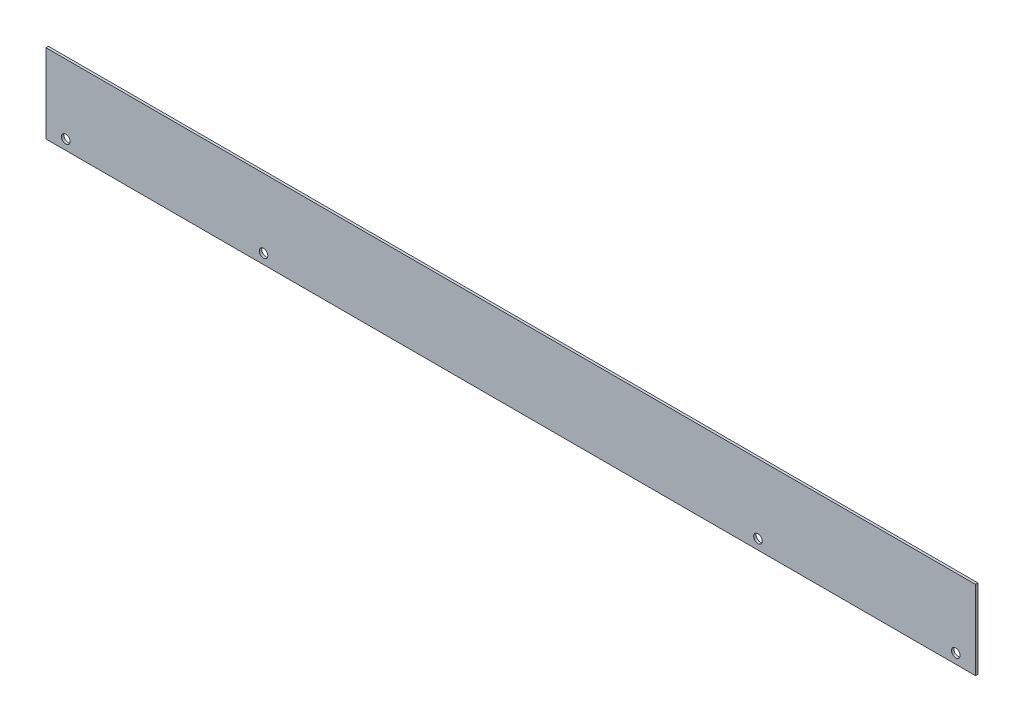
ISO-10303-21;
HEADER;
FILE_DESCRIPTION(('STEP AP214'),'2;1');
FILE_NAME('part.step','',(''),(''),'','','');
FILE_SCHEMA(('AUTOMOTIVE_DESIGN { 1 0 10303 214 1 1 1 1 }'));
ENDSEC;
DATA;
#1=APPLICATION_CONTEXT('core data for automotive mechanical design processes');
#2=APPLICATION_PROTOCOL_DEFINITION('international standard','automotive_design',2000,#1);
#3=PRODUCT_CONTEXT('',#1,'mechanical');
#4=PRODUCT('Part','Part','',(#3));
#5=PRODUCT_RELATED_PRODUCT_CATEGORY('part','',(#4));
#6=PRODUCT_DEFINITION_FORMATION('','',#4);
#7=PRODUCT_DEFINITION_CONTEXT('part definition',#1,'design');
#8=PRODUCT_DEFINITION('design','',#6,#7);
#9=PRODUCT_DEFINITION_SHAPE('','',#8);
#10=(LENGTH_UNIT() NAMED_UNIT(*) SI_UNIT(.MILLI.,.METRE.));
#11=(NAMED_UNIT(*) PLANE_ANGLE_UNIT() SI_UNIT($,.RADIAN.));
#12=(NAMED_UNIT(*) SI_UNIT($,.STERADIAN.) SOLID_ANGLE_UNIT());
#13=UNCERTAINTY_MEASURE_WITH_UNIT(LENGTH_MEASURE(1.E-05),#10,'distance_accuracy_value','');
#14=(GEOMETRIC_REPRESENTATION_CONTEXT(3) GLOBAL_UNCERTAINTY_ASSIGNED_CONTEXT((#13)) GLOBAL_UNIT_ASSIGNED_CONTEXT((#10,
#11,#12)) REPRESENTATION_CONTEXT('',''));
#15=CARTESIAN_POINT('',(0.,0.,0.));
#16=DIRECTION('',(0.,0.,1.));
#17=DIRECTION('',(1.,0.,0.));
#18=AXIS2_PLACEMENT_3D('',#15,#16,#17);
#19=CARTESIAN_POINT('',(0.,0.,1.5875));
#20=DIRECTION('',(0.,1.,0.));
#21=DIRECTION('',(0.,0.,1.));
#22=AXIS2_PLACEMENT_3D('',#19,#20,#21);
#23=PLANE('',#22);
#24=DIRECTION('',(1.,0.,0.));
#25=VECTOR('',#24,1.);
#26=CARTESIAN_POINT('',(0.,0.,0.));
#27=LINE('',#26,#25);
#28=CARTESIAN_POINT('',(0.,0.,0.));
#29=VERTEX_POINT('',#28);
#30=CARTESIAN_POINT('',(596.9,0.,0.));
#31=VERTEX_POINT('',#30);
#32=EDGE_CURVE('E97',#29,#31,#27,.T.);
#33=ORIENTED_EDGE('',*,*,#32,.T.);
#34=DIRECTION('',(0.,0.,-1.));
#35=VECTOR('',#34,1.);
#36=CARTESIAN_POINT('',(596.9,0.,1.5875));
#37=LINE('',#36,#35);
#38=CARTESIAN_POINT('',(596.9,0.,1.5875));
#39=VERTEX_POINT('',#38);
#40=EDGE_CURVE('E11',#39,#31,#37,.T.);
#41=ORIENTED_EDGE('',*,*,#40,.F.);
#42=DIRECTION('',(1.,0.,0.));
#43=VECTOR('',#42,1.);
#44=CARTESIAN_POINT('',(0.,0.,1.5875));
#45=LINE('',#44,#43);
#46=CARTESIAN_POINT('',(0.,0.,1.5875));
#47=VERTEX_POINT('',#46);
#48=EDGE_CURVE('E85',#47,#39,#45,.T.);
#49=ORIENTED_EDGE('',*,*,#48,.F.);
#50=DIRECTION('',(0.,0.,-1.));
#51=VECTOR('',#50,1.);
#52=CARTESIAN_POINT('',(0.,0.,1.5875));
#53=LINE('',#52,#51);
#54=EDGE_CURVE('E93',#47,#29,#53,.T.);
#55=ORIENTED_EDGE('',*,*,#54,.T.);
#56=EDGE_LOOP('',(#33,#41,#49,#55));
#57=FACE_BOUND('',#56,.T.);
#58=ADVANCED_FACE('F34',(#57),#23,.F.);
#59=CARTESIAN_POINT('',(596.9,0.,1.5875));
#60=DIRECTION('',(-1.,0.,0.));
#61=DIRECTION('',(0.,0.,1.));
#62=AXIS2_PLACEMENT_3D('',#59,#60,#61);
#63=PLANE('',#62);
#64=DIRECTION('',(0.,1.,0.));
#65=VECTOR('',#64,1.);
#66=CARTESIAN_POINT('',(596.9,0.,0.));
#67=LINE('',#66,#65);
#68=CARTESIAN_POINT('',(596.9,50.8,0.));
#69=VERTEX_POINT('',#68);
#70=EDGE_CURVE('E89',#31,#69,#67,.T.);
#71=ORIENTED_EDGE('',*,*,#70,.T.);
#72=DIRECTION('',(0.,0.,-1.));
#73=VECTOR('',#72,1.);
#74=CARTESIAN_POINT('',(596.9,50.8,1.5875));
#75=LINE('',#74,#73);
#76=CARTESIAN_POINT('',(596.9,50.8,1.5875));
#77=VERTEX_POINT('',#76);
#78=EDGE_CURVE('E42',#77,#69,#75,.T.);
#79=ORIENTED_EDGE('',*,*,#78,.F.);
#80=DIRECTION('',(0.,1.,0.));
#81=VECTOR('',#80,1.);
#82=CARTESIAN_POINT('',(596.9,0.,1.5875));
#83=LINE('',#82,#81);
#84=EDGE_CURVE('E80',#39,#77,#83,.T.);
#85=ORIENTED_EDGE('',*,*,#84,.F.);
#86=ORIENTED_EDGE('',*,*,#40,.T.);
#87=EDGE_LOOP('',(#71,#79,#85,#86));
#88=FACE_BOUND('',#87,.T.);
#89=ADVANCED_FACE('F88',(#88),#63,.F.);
#90=CARTESIAN_POINT('',(0.,50.8,1.5875));
#91=DIRECTION('',(0.,-1.,0.));
#92=DIRECTION('',(0.,0.,-1.));
#93=AXIS2_PLACEMENT_3D('',#90,#91,#92);
#94=PLANE('',#93);
#95=DIRECTION('',(-1.,0.,0.));
#96=VECTOR('',#95,1.);
#97=CARTESIAN_POINT('',(0.,50.8,0.));
#98=LINE('',#97,#96);
#99=CARTESIAN_POINT('',(0.,50.8,0.));
#100=VERTEX_POINT('',#99);
#101=EDGE_CURVE('E67',#69,#100,#98,.T.);
#102=ORIENTED_EDGE('',*,*,#101,.T.);
#103=DIRECTION('',(0.,0.,-1.));
#104=VECTOR('',#103,1.);
#105=CARTESIAN_POINT('',(0.,50.8,1.5875));
#106=LINE('',#105,#104);
#107=CARTESIAN_POINT('',(0.,50.8,1.5875));
#108=VERTEX_POINT('',#107);
#109=EDGE_CURVE('E90',#108,#100,#106,.T.);
#110=ORIENTED_EDGE('',*,*,#109,.F.);
#111=DIRECTION('',(-1.,0.,0.));
#112=VECTOR('',#111,1.);
#113=CARTESIAN_POINT('',(0.,50.8,1.5875));
#114=LINE('',#113,#112);
#115=EDGE_CURVE('E83',#77,#108,#114,.T.);
#116=ORIENTED_EDGE('',*,*,#115,.F.);
#117=ORIENTED_EDGE('',*,*,#78,.T.);
#118=EDGE_LOOP('',(#102,#110,#116,#117));
#119=FACE_BOUND('',#118,.T.);
#120=ADVANCED_FACE('F91',(#119),#94,.F.);
#121=CARTESIAN_POINT('',(0.,0.,1.5875));
#122=DIRECTION('',(1.,0.,0.));
#123=DIRECTION('',(0.,0.,-1.));
#124=AXIS2_PLACEMENT_3D('',#121,#122,#123);
#125=PLANE('',#124);
#126=DIRECTION('',(0.,-1.,0.));
#127=VECTOR('',#126,1.);
#128=CARTESIAN_POINT('',(0.,0.,0.));
#129=LINE('',#128,#127);
#130=EDGE_CURVE('E73',#100,#29,#129,.T.);
#131=ORIENTED_EDGE('',*,*,#130,.T.);
#132=ORIENTED_EDGE('',*,*,#54,.F.);
#133=DIRECTION('',(0.,-1.,0.));
#134=VECTOR('',#133,1.);
#135=CARTESIAN_POINT('',(0.,0.,1.5875));
#136=LINE('',#135,#134);
#137=EDGE_CURVE('E50',#108,#47,#136,.T.);
#138=ORIENTED_EDGE('',*,*,#137,.F.);
#139=ORIENTED_EDGE('',*,*,#109,.T.);
#140=EDGE_LOOP('',(#131,#132,#138,#139));
#141=FACE_BOUND('',#140,.T.);
#142=ADVANCED_FACE('F105',(#141),#125,.F.);
#143=CARTESIAN_POINT('',(0.,0.,1.5875));
#144=DIRECTION('',(0.,0.,1.));
#145=DIRECTION('',(1.,0.,0.));
#146=AXIS2_PLACEMENT_3D('',#143,#144,#145);
#147=PLANE('',#146);
#148=CARTESIAN_POINT('',(584.2,6.35,1.5875));
#149=DIRECTION('',(0.,0.,1.));
#150=DIRECTION('',(1.,0.,0.));
#151=AXIS2_PLACEMENT_3D('',#148,#149,#150);
#152=CIRCLE('',#151,2.75000000000003);
#153=CARTESIAN_POINT('',(586.95,6.35,1.5875));
#154=VERTEX_POINT('',#153);
#155=EDGE_CURVE('E131',#154,#154,#152,.T.);
#156=ORIENTED_EDGE('',*,*,#155,.F.);
#157=EDGE_LOOP('',(#156));
#158=FACE_BOUND('',#157,.T.);
#159=CARTESIAN_POINT('',(457.2,6.35,1.5875));
#160=DIRECTION('',(0.,0.,1.));
#161=DIRECTION('',(1.,0.,0.));
#162=AXIS2_PLACEMENT_3D('',#159,#160,#161);
#163=CIRCLE('',#162,2.74999999999997);
#164=CARTESIAN_POINT('',(459.95,6.35,1.5875));
#165=VERTEX_POINT('',#164);
#166=EDGE_CURVE('E125',#165,#165,#163,.T.);
#167=ORIENTED_EDGE('',*,*,#166,.F.);
#168=EDGE_LOOP('',(#167));
#169=FACE_BOUND('',#168,.T.);
#170=CARTESIAN_POINT('',(139.7,6.35,1.5875));
#171=DIRECTION('',(0.,0.,1.));
#172=DIRECTION('',(1.,0.,0.));
#173=AXIS2_PLACEMENT_3D('',#170,#171,#172);
#174=CIRCLE('',#173,2.74999999999997);
#175=CARTESIAN_POINT('',(142.45,6.35,1.5875));
#176=VERTEX_POINT('',#175);
#177=EDGE_CURVE('E119',#176,#176,#174,.T.);
#178=ORIENTED_EDGE('',*,*,#177,.F.);
#179=EDGE_LOOP('',(#178));
#180=FACE_BOUND('',#179,.T.);
#181=CARTESIAN_POINT('',(12.7,6.35,1.5875));
#182=DIRECTION('',(0.,0.,1.));
#183=DIRECTION('',(1.,0.,0.));
#184=AXIS2_PLACEMENT_3D('',#181,#182,#183);
#185=CIRCLE('',#184,2.74999999999999);
#186=CARTESIAN_POINT('',(15.45,6.35,1.5875));
#187=VERTEX_POINT('',#186);
#188=EDGE_CURVE('E113',#187,#187,#185,.T.);
#189=ORIENTED_EDGE('',*,*,#188,.F.);
#190=EDGE_LOOP('',(#189));
#191=FACE_BOUND('',#190,.T.);
#192=ORIENTED_EDGE('',*,*,#48,.T.);
#193=ORIENTED_EDGE('',*,*,#84,.T.);
#194=ORIENTED_EDGE('',*,*,#115,.T.);
#195=ORIENTED_EDGE('',*,*,#137,.T.);
#196=EDGE_LOOP('',(#192,#193,#194,#195));
#197=FACE_BOUND('',#196,.T.);
#198=ADVANCED_FACE('F81',(#158,#169,#180,#191,#197),#147,.T.);
#199=CARTESIAN_POINT('',(0.,0.,0.));
#200=DIRECTION('',(0.,0.,1.));
#201=DIRECTION('',(1.,0.,0.));
#202=AXIS2_PLACEMENT_3D('',#199,#200,#201);
#203=PLANE('',#202);
#204=CARTESIAN_POINT('',(584.2,6.35,0.));
#205=DIRECTION('',(0.,0.,1.));
#206=DIRECTION('',(1.,0.,0.));
#207=AXIS2_PLACEMENT_3D('',#204,#205,#206);
#208=CIRCLE('',#207,2.75000000000003);
#209=CARTESIAN_POINT('',(586.95,6.35,0.));
#210=VERTEX_POINT('',#209);
#211=EDGE_CURVE('E128',#210,#210,#208,.T.);
#212=ORIENTED_EDGE('',*,*,#211,.T.);
#213=EDGE_LOOP('',(#212));
#214=FACE_BOUND('',#213,.T.);
#215=CARTESIAN_POINT('',(457.2,6.35,0.));
#216=DIRECTION('',(0.,0.,1.));
#217=DIRECTION('',(1.,0.,0.));
#218=AXIS2_PLACEMENT_3D('',#215,#216,#217);
#219=CIRCLE('',#218,2.74999999999997);
#220=CARTESIAN_POINT('',(459.95,6.35,0.));
#221=VERTEX_POINT('',#220);
#222=EDGE_CURVE('E122',#221,#221,#219,.T.);
#223=ORIENTED_EDGE('',*,*,#222,.T.);
#224=EDGE_LOOP('',(#223));
#225=FACE_BOUND('',#224,.T.);
#226=CARTESIAN_POINT('',(139.7,6.35,0.));
#227=DIRECTION('',(0.,0.,1.));
#228=DIRECTION('',(1.,0.,0.));
#229=AXIS2_PLACEMENT_3D('',#226,#227,#228);
#230=CIRCLE('',#229,2.75);
#231=CARTESIAN_POINT('',(142.45,6.35,0.));
#232=VERTEX_POINT('',#231);
#233=EDGE_CURVE('E116',#232,#232,#230,.T.);
#234=ORIENTED_EDGE('',*,*,#233,.T.);
#235=EDGE_LOOP('',(#234));
#236=FACE_BOUND('',#235,.T.);
#237=CARTESIAN_POINT('',(12.7,6.35,0.));
#238=DIRECTION('',(0.,0.,1.));
#239=DIRECTION('',(1.,0.,0.));
#240=AXIS2_PLACEMENT_3D('',#237,#238,#239);
#241=CIRCLE('',#240,2.75);
#242=CARTESIAN_POINT('',(15.45,6.35,0.));
#243=VERTEX_POINT('',#242);
#244=EDGE_CURVE('E100',#243,#243,#241,.T.);
#245=ORIENTED_EDGE('',*,*,#244,.T.);
#246=EDGE_LOOP('',(#245));
#247=FACE_BOUND('',#246,.T.);
#248=ORIENTED_EDGE('',*,*,#32,.F.);
#249=ORIENTED_EDGE('',*,*,#130,.F.);
#250=ORIENTED_EDGE('',*,*,#101,.F.);
#251=ORIENTED_EDGE('',*,*,#70,.F.);
#252=EDGE_LOOP('',(#248,#249,#250,#251));
#253=FACE_BOUND('',#252,.T.);
#254=ADVANCED_FACE('F108',(#214,#225,#236,#247,#253),#203,.F.);
#255=CARTESIAN_POINT('',(12.7,6.35,1.5875));
#256=DIRECTION('',(0.,0.,1.));
#257=DIRECTION('',(1.,0.,0.));
#258=AXIS2_PLACEMENT_3D('',#255,#256,#257);
#259=CYLINDRICAL_SURFACE('',#258,2.74999999999999);
#260=ORIENTED_EDGE('',*,*,#244,.F.);
#261=EDGE_LOOP('',(#260));
#262=FACE_BOUND('',#261,.T.);
#263=ORIENTED_EDGE('',*,*,#188,.T.);
#264=EDGE_LOOP('',(#263));
#265=FACE_BOUND('',#264,.T.);
#266=ADVANCED_FACE('F146',(#262,#265),#259,.F.);
#267=CARTESIAN_POINT('',(139.7,6.35,1.5875));
#268=DIRECTION('',(0.,0.,1.));
#269=DIRECTION('',(1.,0.,0.));
#270=AXIS2_PLACEMENT_3D('',#267,#268,#269);
#271=CYLINDRICAL_SURFACE('',#270,2.74999999999999);
#272=ORIENTED_EDGE('',*,*,#233,.F.);
#273=EDGE_LOOP('',(#272));
#274=FACE_BOUND('',#273,.T.);
#275=ORIENTED_EDGE('',*,*,#177,.T.);
#276=EDGE_LOOP('',(#275));
#277=FACE_BOUND('',#276,.T.);
#278=ADVANCED_FACE('F148',(#274,#277),#271,.F.);
#279=CARTESIAN_POINT('',(457.2,6.35,1.5875));
#280=DIRECTION('',(0.,0.,1.));
#281=DIRECTION('',(1.,0.,0.));
#282=AXIS2_PLACEMENT_3D('',#279,#280,#281);
#283=CYLINDRICAL_SURFACE('',#282,2.74999999999997);
#284=ORIENTED_EDGE('',*,*,#222,.F.);
#285=EDGE_LOOP('',(#284));
#286=FACE_BOUND('',#285,.T.);
#287=ORIENTED_EDGE('',*,*,#166,.T.);
#288=EDGE_LOOP('',(#287));
#289=FACE_BOUND('',#288,.T.);
#290=ADVANCED_FACE('F155',(#286,#289),#283,.F.);
#291=CARTESIAN_POINT('',(584.2,6.35,1.5875));
#292=DIRECTION('',(0.,0.,1.));
#293=DIRECTION('',(1.,0.,0.));
#294=AXIS2_PLACEMENT_3D('',#291,#292,#293);
#295=CYLINDRICAL_SURFACE('',#294,2.75000000000003);
#296=ORIENTED_EDGE('',*,*,#211,.F.);
#297=EDGE_LOOP('',(#296));
#298=FACE_BOUND('',#297,.T.);
#299=ORIENTED_EDGE('',*,*,#155,.T.);
#300=EDGE_LOOP('',(#299));
#301=FACE_BOUND('',#300,.T.);
#302=ADVANCED_FACE('F135',(#298,#301),#295,.F.);
#303=CLOSED_SHELL('',(#58,#89,#120,#142,#198,#254,#266,#278,#290,#302));
#304=MANIFOLD_SOLID_BREP('B2',#303);
#305=ADVANCED_BREP_SHAPE_REPRESENTATION('',(#18,#304),#14);
#306=SHAPE_DEFINITION_REPRESENTATION(#9,#305);
ENDSEC;
END-ISO-10303-21;
